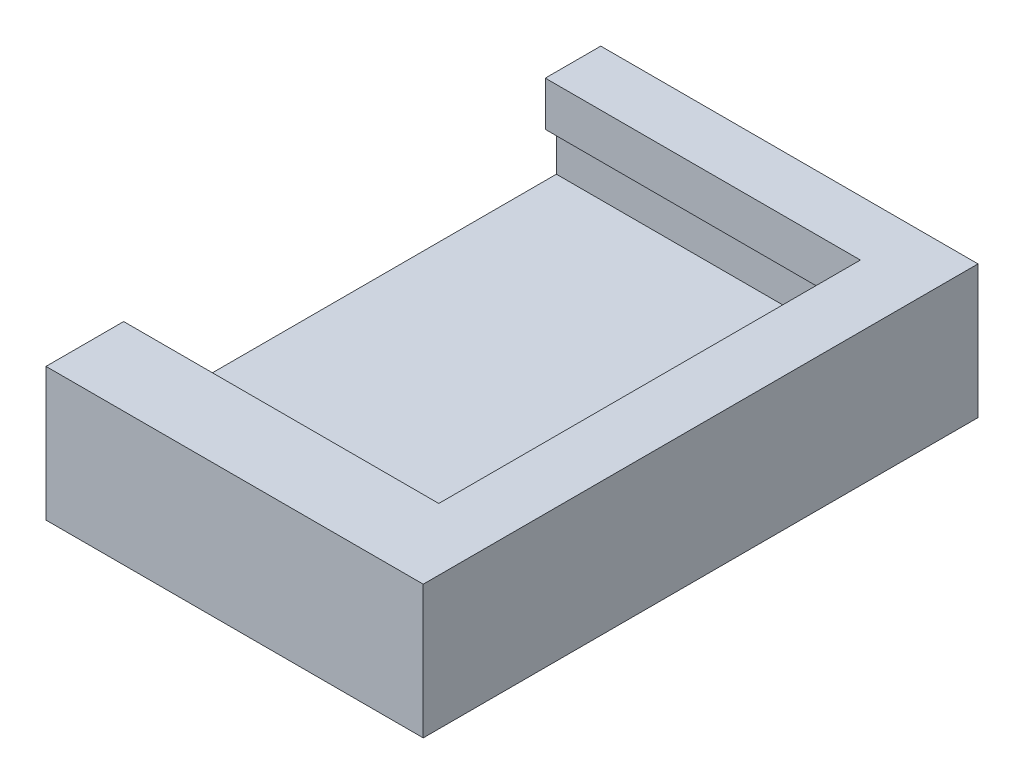
ISO-10303-21;
HEADER;
FILE_DESCRIPTION(('STEP AP214'),'2;1');
FILE_NAME('part.step','',(''),(''),'','','');
FILE_SCHEMA(('AUTOMOTIVE_DESIGN { 1 0 10303 214 1 1 1 1 }'));
ENDSEC;
DATA;
#1=APPLICATION_CONTEXT('core data for automotive mechanical design processes');
#2=APPLICATION_PROTOCOL_DEFINITION('international standard','automotive_design',2000,#1);
#3=PRODUCT_CONTEXT('',#1,'mechanical');
#4=PRODUCT('Part','Part','',(#3));
#5=PRODUCT_RELATED_PRODUCT_CATEGORY('part','',(#4));
#6=PRODUCT_DEFINITION_FORMATION('','',#4);
#7=PRODUCT_DEFINITION_CONTEXT('part definition',#1,'design');
#8=PRODUCT_DEFINITION('design','',#6,#7);
#9=PRODUCT_DEFINITION_SHAPE('','',#8);
#10=(LENGTH_UNIT() NAMED_UNIT(*) SI_UNIT(.MILLI.,.METRE.));
#11=(NAMED_UNIT(*) PLANE_ANGLE_UNIT() SI_UNIT($,.RADIAN.));
#12=(NAMED_UNIT(*) SI_UNIT($,.STERADIAN.) SOLID_ANGLE_UNIT());
#13=UNCERTAINTY_MEASURE_WITH_UNIT(LENGTH_MEASURE(1.E-05),#10,'distance_accuracy_value','');
#14=(GEOMETRIC_REPRESENTATION_CONTEXT(3) GLOBAL_UNCERTAINTY_ASSIGNED_CONTEXT((#13)) GLOBAL_UNIT_ASSIGNED_CONTEXT((#10,
#11,#12)) REPRESENTATION_CONTEXT('',''));
#15=CARTESIAN_POINT('',(0.,0.,0.));
#16=DIRECTION('',(0.,0.,1.));
#17=DIRECTION('',(1.,0.,0.));
#18=AXIS2_PLACEMENT_3D('',#15,#16,#17);
#19=CARTESIAN_POINT('',(0.,2.54,0.));
#20=DIRECTION('',(0.,1.,0.));
#21=DIRECTION('',(0.,0.,1.));
#22=AXIS2_PLACEMENT_3D('',#19,#20,#21);
#23=PLANE('',#22);
#24=DIRECTION('',(0.,0.,-1.));
#25=VECTOR('',#24,1.);
#26=CARTESIAN_POINT('',(-9.525,2.54,0.));
#27=LINE('',#26,#25);
#28=CARTESIAN_POINT('',(-9.525,2.54,13.335));
#29=VERTEX_POINT('',#28);
#30=CARTESIAN_POINT('',(-9.525,2.54,-13.335));
#31=VERTEX_POINT('',#30);
#32=EDGE_CURVE('E183',#29,#31,#27,.T.);
#33=ORIENTED_EDGE('',*,*,#32,.F.);
#34=DIRECTION('',(1.,0.,0.));
#35=VECTOR('',#34,1.);
#36=CARTESIAN_POINT('',(-12.065,2.54,13.335));
#37=LINE('',#36,#35);
#38=CARTESIAN_POINT('',(9.525,2.54,13.335));
#39=VERTEX_POINT('',#38);
#40=EDGE_CURVE('E187',#29,#39,#37,.T.);
#41=ORIENTED_EDGE('',*,*,#40,.T.);
#42=DIRECTION('',(0.,0.,-1.));
#43=VECTOR('',#42,1.);
#44=CARTESIAN_POINT('',(9.525,2.54,13.335));
#45=LINE('',#44,#43);
#46=CARTESIAN_POINT('',(9.525,2.54,-13.335));
#47=VERTEX_POINT('',#46);
#48=EDGE_CURVE('E192',#39,#47,#45,.T.);
#49=ORIENTED_EDGE('',*,*,#48,.T.);
#50=DIRECTION('',(-1.,0.,0.));
#51=VECTOR('',#50,1.);
#52=CARTESIAN_POINT('',(9.525,2.54,-13.335));
#53=LINE('',#52,#51);
#54=EDGE_CURVE('E200',#47,#31,#53,.T.);
#55=ORIENTED_EDGE('',*,*,#54,.T.);
#56=EDGE_LOOP('',(#33,#41,#49,#55));
#57=FACE_BOUND('',#56,.T.);
#58=ADVANCED_FACE('F33',(#57),#23,.T.);
#59=CARTESIAN_POINT('',(12.065,2.54,15.875));
#60=DIRECTION('',(0.,0.,-1.));
#61=DIRECTION('',(-1.,0.,0.));
#62=AXIS2_PLACEMENT_3D('',#59,#60,#61);
#63=PLANE('',#62);
#64=DIRECTION('',(0.,-1.,0.));
#65=VECTOR('',#64,1.);
#66=CARTESIAN_POINT('',(12.065,2.54,15.875));
#67=LINE('',#66,#65);
#68=CARTESIAN_POINT('',(12.065,7.62,15.875));
#69=VERTEX_POINT('',#68);
#70=CARTESIAN_POINT('',(12.065,0.,15.875));
#71=VERTEX_POINT('',#70);
#72=EDGE_CURVE('E11',#69,#71,#67,.T.);
#73=ORIENTED_EDGE('',*,*,#72,.F.);
#74=DIRECTION('',(1.,0.,0.));
#75=VECTOR('',#74,1.);
#76=CARTESIAN_POINT('',(12.065,7.62,15.875));
#77=LINE('',#76,#75);
#78=CARTESIAN_POINT('',(-9.525,7.62,15.875));
#79=VERTEX_POINT('',#78);
#80=EDGE_CURVE('E140',#79,#69,#77,.T.);
#81=ORIENTED_EDGE('',*,*,#80,.F.);
#82=DIRECTION('',(0.,1.,0.));
#83=VECTOR('',#82,1.);
#84=CARTESIAN_POINT('',(-9.525,0.,15.875));
#85=LINE('',#84,#83);
#86=CARTESIAN_POINT('',(-9.525,0.,15.875));
#87=VERTEX_POINT('',#86);
#88=EDGE_CURVE('E179',#87,#79,#85,.T.);
#89=ORIENTED_EDGE('',*,*,#88,.F.);
#90=DIRECTION('',(1.,0.,0.));
#91=VECTOR('',#90,1.);
#92=CARTESIAN_POINT('',(12.065,0.,15.875));
#93=LINE('',#92,#91);
#94=EDGE_CURVE('E55',#87,#71,#93,.T.);
#95=ORIENTED_EDGE('',*,*,#94,.T.);
#96=EDGE_LOOP('',(#73,#81,#89,#95));
#97=FACE_BOUND('',#96,.T.);
#98=ADVANCED_FACE('F35',(#97),#63,.F.);
#99=CARTESIAN_POINT('',(12.065,2.54,15.875));
#100=DIRECTION('',(-1.,0.,0.));
#101=DIRECTION('',(0.,0.,1.));
#102=AXIS2_PLACEMENT_3D('',#99,#100,#101);
#103=PLANE('',#102);
#104=DIRECTION('',(0.,0.,-1.));
#105=VECTOR('',#104,1.);
#106=CARTESIAN_POINT('',(12.065,0.,15.875));
#107=LINE('',#106,#105);
#108=CARTESIAN_POINT('',(12.065,0.,-15.875));
#109=VERTEX_POINT('',#108);
#110=EDGE_CURVE('E47',#71,#109,#107,.T.);
#111=ORIENTED_EDGE('',*,*,#110,.T.);
#112=DIRECTION('',(0.,-1.,0.));
#113=VECTOR('',#112,1.);
#114=CARTESIAN_POINT('',(12.065,2.54,-15.875));
#115=LINE('',#114,#113);
#116=CARTESIAN_POINT('',(12.065,7.62,-15.875));
#117=VERTEX_POINT('',#116);
#118=EDGE_CURVE('E41',#117,#109,#115,.T.);
#119=ORIENTED_EDGE('',*,*,#118,.F.);
#120=DIRECTION('',(0.,0.,-1.));
#121=VECTOR('',#120,1.);
#122=CARTESIAN_POINT('',(12.065,7.62,-15.875));
#123=LINE('',#122,#121);
#124=EDGE_CURVE('E123',#69,#117,#123,.T.);
#125=ORIENTED_EDGE('',*,*,#124,.F.);
#126=ORIENTED_EDGE('',*,*,#72,.T.);
#127=EDGE_LOOP('',(#111,#119,#125,#126));
#128=FACE_BOUND('',#127,.T.);
#129=ADVANCED_FACE('F121',(#128),#103,.F.);
#130=CARTESIAN_POINT('',(12.065,2.54,-15.875));
#131=DIRECTION('',(0.,0.,1.));
#132=DIRECTION('',(1.,0.,0.));
#133=AXIS2_PLACEMENT_3D('',#130,#131,#132);
#134=PLANE('',#133);
#135=DIRECTION('',(-1.,0.,0.));
#136=VECTOR('',#135,1.);
#137=CARTESIAN_POINT('',(12.065,0.,-15.875));
#138=LINE('',#137,#136);
#139=CARTESIAN_POINT('',(-9.525,0.,-15.875));
#140=VERTEX_POINT('',#139);
#141=EDGE_CURVE('E127',#109,#140,#138,.T.);
#142=ORIENTED_EDGE('',*,*,#141,.T.);
#143=DIRECTION('',(0.,-1.,0.));
#144=VECTOR('',#143,1.);
#145=CARTESIAN_POINT('',(-9.525,0.,-15.875));
#146=LINE('',#145,#144);
#147=CARTESIAN_POINT('',(-9.525,7.62,-15.875));
#148=VERTEX_POINT('',#147);
#149=EDGE_CURVE('E131',#148,#140,#146,.T.);
#150=ORIENTED_EDGE('',*,*,#149,.F.);
#151=DIRECTION('',(-1.,0.,0.));
#152=VECTOR('',#151,1.);
#153=CARTESIAN_POINT('',(12.065,7.62,-15.875));
#154=LINE('',#153,#152);
#155=EDGE_CURVE('E129',#117,#148,#154,.T.);
#156=ORIENTED_EDGE('',*,*,#155,.F.);
#157=ORIENTED_EDGE('',*,*,#118,.T.);
#158=EDGE_LOOP('',(#142,#150,#156,#157));
#159=FACE_BOUND('',#158,.T.);
#160=ADVANCED_FACE('F130',(#159),#134,.F.);
#161=CARTESIAN_POINT('',(0.,0.,0.));
#162=DIRECTION('',(0.,1.,0.));
#163=DIRECTION('',(0.,0.,1.));
#164=AXIS2_PLACEMENT_3D('',#161,#162,#163);
#165=PLANE('',#164);
#166=ORIENTED_EDGE('',*,*,#94,.F.);
#167=DIRECTION('',(0.,0.,1.));
#168=VECTOR('',#167,1.);
#169=CARTESIAN_POINT('',(-9.525,0.,-15.875));
#170=LINE('',#169,#168);
#171=EDGE_CURVE('E177',#140,#87,#170,.T.);
#172=ORIENTED_EDGE('',*,*,#171,.F.);
#173=ORIENTED_EDGE('',*,*,#141,.F.);
#174=ORIENTED_EDGE('',*,*,#110,.F.);
#175=EDGE_LOOP('',(#166,#172,#173,#174));
#176=FACE_BOUND('',#175,.T.);
#177=ADVANCED_FACE('F213',(#176),#165,.F.);
#178=CARTESIAN_POINT('',(-12.065,5.08,13.335));
#179=DIRECTION('',(0.,0.,-1.));
#180=DIRECTION('',(-1.,0.,0.));
#181=AXIS2_PLACEMENT_3D('',#178,#179,#180);
#182=PLANE('',#181);
#183=DIRECTION('',(0.,-1.,0.));
#184=VECTOR('',#183,1.);
#185=CARTESIAN_POINT('',(-9.525,5.08,13.335));
#186=LINE('',#185,#184);
#187=CARTESIAN_POINT('',(-9.525,5.08,13.335));
#188=VERTEX_POINT('',#187);
#189=EDGE_CURVE('E185',#188,#29,#186,.T.);
#190=ORIENTED_EDGE('',*,*,#189,.F.);
#191=DIRECTION('',(-1.,0.,0.));
#192=VECTOR('',#191,1.);
#193=CARTESIAN_POINT('',(9.525,5.08,13.335));
#194=LINE('',#193,#192);
#195=CARTESIAN_POINT('',(9.525,5.08,13.335));
#196=VERTEX_POINT('',#195);
#197=EDGE_CURVE('E188',#196,#188,#194,.T.);
#198=ORIENTED_EDGE('',*,*,#197,.F.);
#199=DIRECTION('',(0.,-1.,0.));
#200=VECTOR('',#199,1.);
#201=CARTESIAN_POINT('',(9.525,5.08,13.335));
#202=LINE('',#201,#200);
#203=EDGE_CURVE('E198',#196,#39,#202,.T.);
#204=ORIENTED_EDGE('',*,*,#203,.T.);
#205=ORIENTED_EDGE('',*,*,#40,.F.);
#206=EDGE_LOOP('',(#190,#198,#204,#205));
#207=FACE_BOUND('',#206,.T.);
#208=ADVANCED_FACE('F229',(#207),#182,.T.);
#209=CARTESIAN_POINT('',(9.525,5.08,-13.335));
#210=DIRECTION('',(0.,0.,1.));
#211=DIRECTION('',(1.,0.,0.));
#212=AXIS2_PLACEMENT_3D('',#209,#210,#211);
#213=PLANE('',#212);
#214=DIRECTION('',(0.,1.,0.));
#215=VECTOR('',#214,1.);
#216=CARTESIAN_POINT('',(-9.525,5.08,-13.335));
#217=LINE('',#216,#215);
#218=CARTESIAN_POINT('',(-9.525,5.08,-13.335));
#219=VERTEX_POINT('',#218);
#220=EDGE_CURVE('E181',#31,#219,#217,.T.);
#221=ORIENTED_EDGE('',*,*,#220,.F.);
#222=ORIENTED_EDGE('',*,*,#54,.F.);
#223=DIRECTION('',(0.,-1.,0.));
#224=VECTOR('',#223,1.);
#225=CARTESIAN_POINT('',(9.525,5.08,-13.335));
#226=LINE('',#225,#224);
#227=CARTESIAN_POINT('',(9.525,5.08,-13.335));
#228=VERTEX_POINT('',#227);
#229=EDGE_CURVE('E207',#228,#47,#226,.T.);
#230=ORIENTED_EDGE('',*,*,#229,.F.);
#231=DIRECTION('',(1.,0.,0.));
#232=VECTOR('',#231,1.);
#233=CARTESIAN_POINT('',(-12.065,5.08,-13.335));
#234=LINE('',#233,#232);
#235=EDGE_CURVE('E191',#219,#228,#234,.T.);
#236=ORIENTED_EDGE('',*,*,#235,.F.);
#237=EDGE_LOOP('',(#221,#222,#230,#236));
#238=FACE_BOUND('',#237,.T.);
#239=ADVANCED_FACE('F248',(#238),#213,.T.);
#240=CARTESIAN_POINT('',(9.525,5.08,13.335));
#241=DIRECTION('',(-1.,0.,0.));
#242=DIRECTION('',(0.,0.,1.));
#243=AXIS2_PLACEMENT_3D('',#240,#241,#242);
#244=PLANE('',#243);
#245=ORIENTED_EDGE('',*,*,#48,.F.);
#246=ORIENTED_EDGE('',*,*,#203,.F.);
#247=DIRECTION('',(0.,0.,-1.));
#248=VECTOR('',#247,1.);
#249=CARTESIAN_POINT('',(9.525,5.08,13.335));
#250=LINE('',#249,#248);
#251=EDGE_CURVE('E195',#196,#228,#250,.T.);
#252=ORIENTED_EDGE('',*,*,#251,.T.);
#253=ORIENTED_EDGE('',*,*,#229,.T.);
#254=EDGE_LOOP('',(#245,#246,#252,#253));
#255=FACE_BOUND('',#254,.T.);
#256=ADVANCED_FACE('F255',(#255),#244,.T.);
#257=CARTESIAN_POINT('',(-9.525,0.,0.));
#258=DIRECTION('',(1.,0.,0.));
#259=DIRECTION('',(0.,0.,-1.));
#260=AXIS2_PLACEMENT_3D('',#257,#258,#259);
#261=PLANE('',#260);
#262=ORIENTED_EDGE('',*,*,#189,.T.);
#263=ORIENTED_EDGE('',*,*,#32,.T.);
#264=ORIENTED_EDGE('',*,*,#220,.T.);
#265=DIRECTION('',(0.,0.,1.));
#266=VECTOR('',#265,1.);
#267=CARTESIAN_POINT('',(-9.525,5.08,-15.875));
#268=LINE('',#267,#266);
#269=CARTESIAN_POINT('',(-9.525,5.08,-12.7));
#270=VERTEX_POINT('',#269);
#271=EDGE_CURVE('E158',#219,#270,#268,.T.);
#272=ORIENTED_EDGE('',*,*,#271,.T.);
#273=DIRECTION('',(0.,-1.,0.));
#274=VECTOR('',#273,1.);
#275=CARTESIAN_POINT('',(-9.525,7.62,-12.7));
#276=LINE('',#275,#274);
#277=CARTESIAN_POINT('',(-9.525,7.62,-12.7));
#278=VERTEX_POINT('',#277);
#279=EDGE_CURVE('E173',#278,#270,#276,.T.);
#280=ORIENTED_EDGE('',*,*,#279,.F.);
#281=DIRECTION('',(0.,0.,1.));
#282=VECTOR('',#281,1.);
#283=CARTESIAN_POINT('',(-9.525,7.62,-15.875));
#284=LINE('',#283,#282);
#285=EDGE_CURVE('E134',#148,#278,#284,.T.);
#286=ORIENTED_EDGE('',*,*,#285,.F.);
#287=ORIENTED_EDGE('',*,*,#149,.T.);
#288=ORIENTED_EDGE('',*,*,#171,.T.);
#289=ORIENTED_EDGE('',*,*,#88,.T.);
#290=DIRECTION('',(0.,0.,1.));
#291=VECTOR('',#290,1.);
#292=CARTESIAN_POINT('',(-9.525,7.62,11.43));
#293=LINE('',#292,#291);
#294=CARTESIAN_POINT('',(-9.525,7.62,11.43));
#295=VERTEX_POINT('',#294);
#296=EDGE_CURVE('E154',#295,#79,#293,.T.);
#297=ORIENTED_EDGE('',*,*,#296,.F.);
#298=DIRECTION('',(0.,-1.,0.));
#299=VECTOR('',#298,1.);
#300=CARTESIAN_POINT('',(-9.525,7.62,11.43));
#301=LINE('',#300,#299);
#302=CARTESIAN_POINT('',(-9.525,5.08,11.43));
#303=VERTEX_POINT('',#302);
#304=EDGE_CURVE('E157',#295,#303,#301,.T.);
#305=ORIENTED_EDGE('',*,*,#304,.T.);
#306=DIRECTION('',(0.,0.,1.));
#307=VECTOR('',#306,1.);
#308=CARTESIAN_POINT('',(-9.525,5.08,11.43));
#309=LINE('',#308,#307);
#310=EDGE_CURVE('E141',#303,#188,#309,.T.);
#311=ORIENTED_EDGE('',*,*,#310,.T.);
#312=EDGE_LOOP('',(#262,#263,#264,#272,#280,#286,#287,#288,#289,#297,#305,#311));
#313=FACE_BOUND('',#312,.T.);
#314=ADVANCED_FACE('F215',(#313),#261,.F.);
#315=CARTESIAN_POINT('',(8.509,7.62,-12.7));
#316=DIRECTION('',(0.,0.,-1.));
#317=DIRECTION('',(-1.,0.,0.));
#318=AXIS2_PLACEMENT_3D('',#315,#316,#317);
#319=PLANE('',#318);
#320=DIRECTION('',(1.,0.,0.));
#321=VECTOR('',#320,1.);
#322=CARTESIAN_POINT('',(8.509,5.08,-12.7));
#323=LINE('',#322,#321);
#324=CARTESIAN_POINT('',(8.509,5.08,-12.7));
#325=VERTEX_POINT('',#324);
#326=EDGE_CURVE('E160',#270,#325,#323,.T.);
#327=ORIENTED_EDGE('',*,*,#326,.T.);
#328=DIRECTION('',(0.,-1.,0.));
#329=VECTOR('',#328,1.);
#330=CARTESIAN_POINT('',(8.509,7.62,-12.7));
#331=LINE('',#330,#329);
#332=CARTESIAN_POINT('',(8.509,7.62,-12.7));
#333=VERTEX_POINT('',#332);
#334=EDGE_CURVE('E170',#333,#325,#331,.T.);
#335=ORIENTED_EDGE('',*,*,#334,.F.);
#336=DIRECTION('',(1.,0.,0.));
#337=VECTOR('',#336,1.);
#338=CARTESIAN_POINT('',(8.509,7.62,-12.7));
#339=LINE('',#338,#337);
#340=EDGE_CURVE('E148',#278,#333,#339,.T.);
#341=ORIENTED_EDGE('',*,*,#340,.F.);
#342=ORIENTED_EDGE('',*,*,#279,.T.);
#343=EDGE_LOOP('',(#327,#335,#341,#342));
#344=FACE_BOUND('',#343,.T.);
#345=ADVANCED_FACE('F269',(#344),#319,.F.);
#346=CARTESIAN_POINT('',(8.509,7.62,-12.7));
#347=DIRECTION('',(1.,0.,0.));
#348=DIRECTION('',(0.,0.,-1.));
#349=AXIS2_PLACEMENT_3D('',#346,#347,#348);
#350=PLANE('',#349);
#351=DIRECTION('',(0.,0.,1.));
#352=VECTOR('',#351,1.);
#353=CARTESIAN_POINT('',(8.509,5.08,-12.7));
#354=LINE('',#353,#352);
#355=CARTESIAN_POINT('',(8.509,5.08,11.43));
#356=VERTEX_POINT('',#355);
#357=EDGE_CURVE('E162',#325,#356,#354,.T.);
#358=ORIENTED_EDGE('',*,*,#357,.T.);
#359=DIRECTION('',(0.,-1.,0.));
#360=VECTOR('',#359,1.);
#361=CARTESIAN_POINT('',(8.509,7.62,11.43));
#362=LINE('',#361,#360);
#363=CARTESIAN_POINT('',(8.509,7.62,11.43));
#364=VERTEX_POINT('',#363);
#365=EDGE_CURVE('E167',#364,#356,#362,.T.);
#366=ORIENTED_EDGE('',*,*,#365,.F.);
#367=DIRECTION('',(0.,0.,1.));
#368=VECTOR('',#367,1.);
#369=CARTESIAN_POINT('',(8.509,7.62,-12.7));
#370=LINE('',#369,#368);
#371=EDGE_CURVE('E150',#333,#364,#370,.T.);
#372=ORIENTED_EDGE('',*,*,#371,.F.);
#373=ORIENTED_EDGE('',*,*,#334,.T.);
#374=EDGE_LOOP('',(#358,#366,#372,#373));
#375=FACE_BOUND('',#374,.T.);
#376=ADVANCED_FACE('F276',(#375),#350,.F.);
#377=CARTESIAN_POINT('',(8.509,7.62,11.43));
#378=DIRECTION('',(0.,0.,1.));
#379=DIRECTION('',(1.,0.,0.));
#380=AXIS2_PLACEMENT_3D('',#377,#378,#379);
#381=PLANE('',#380);
#382=DIRECTION('',(-1.,0.,0.));
#383=VECTOR('',#382,1.);
#384=CARTESIAN_POINT('',(8.509,5.08,11.43));
#385=LINE('',#384,#383);
#386=EDGE_CURVE('E144',#356,#303,#385,.T.);
#387=ORIENTED_EDGE('',*,*,#386,.T.);
#388=ORIENTED_EDGE('',*,*,#304,.F.);
#389=DIRECTION('',(-1.,0.,0.));
#390=VECTOR('',#389,1.);
#391=CARTESIAN_POINT('',(8.509,7.62,11.43));
#392=LINE('',#391,#390);
#393=EDGE_CURVE('E152',#364,#295,#392,.T.);
#394=ORIENTED_EDGE('',*,*,#393,.F.);
#395=ORIENTED_EDGE('',*,*,#365,.T.);
#396=EDGE_LOOP('',(#387,#388,#394,#395));
#397=FACE_BOUND('',#396,.T.);
#398=ADVANCED_FACE('F284',(#397),#381,.F.);
#399=CARTESIAN_POINT('',(0.,7.62,0.));
#400=DIRECTION('',(0.,-1.,0.));
#401=DIRECTION('',(0.,0.,-1.));
#402=AXIS2_PLACEMENT_3D('',#399,#400,#401);
#403=PLANE('',#402);
#404=ORIENTED_EDGE('',*,*,#124,.T.);
#405=ORIENTED_EDGE('',*,*,#155,.T.);
#406=ORIENTED_EDGE('',*,*,#285,.T.);
#407=ORIENTED_EDGE('',*,*,#340,.T.);
#408=ORIENTED_EDGE('',*,*,#371,.T.);
#409=ORIENTED_EDGE('',*,*,#393,.T.);
#410=ORIENTED_EDGE('',*,*,#296,.T.);
#411=ORIENTED_EDGE('',*,*,#80,.T.);
#412=EDGE_LOOP('',(#404,#405,#406,#407,#408,#409,#410,#411));
#413=FACE_BOUND('',#412,.T.);
#414=ADVANCED_FACE('F137',(#413),#403,.F.);
#415=CARTESIAN_POINT('',(0.,5.08,0.));
#416=DIRECTION('',(0.,-1.,0.));
#417=DIRECTION('',(0.,0.,-1.));
#418=AXIS2_PLACEMENT_3D('',#415,#416,#417);
#419=PLANE('',#418);
#420=ORIENTED_EDGE('',*,*,#271,.F.);
#421=ORIENTED_EDGE('',*,*,#235,.T.);
#422=ORIENTED_EDGE('',*,*,#251,.F.);
#423=ORIENTED_EDGE('',*,*,#197,.T.);
#424=ORIENTED_EDGE('',*,*,#310,.F.);
#425=ORIENTED_EDGE('',*,*,#386,.F.);
#426=ORIENTED_EDGE('',*,*,#357,.F.);
#427=ORIENTED_EDGE('',*,*,#326,.F.);
#428=EDGE_LOOP('',(#420,#421,#422,#423,#424,#425,#426,#427));
#429=FACE_BOUND('',#428,.T.);
#430=ADVANCED_FACE('F299',(#429),#419,.T.);
#431=CLOSED_SHELL('',(#58,#98,#129,#160,#177,#208,#239,#256,#314,#345,#376,#398,#414,#430));
#432=MANIFOLD_SOLID_BREP('B2',#431);
#433=ADVANCED_BREP_SHAPE_REPRESENTATION('',(#18,#432),#14);
#434=SHAPE_DEFINITION_REPRESENTATION(#9,#433);
ENDSEC;
END-ISO-10303-21;
